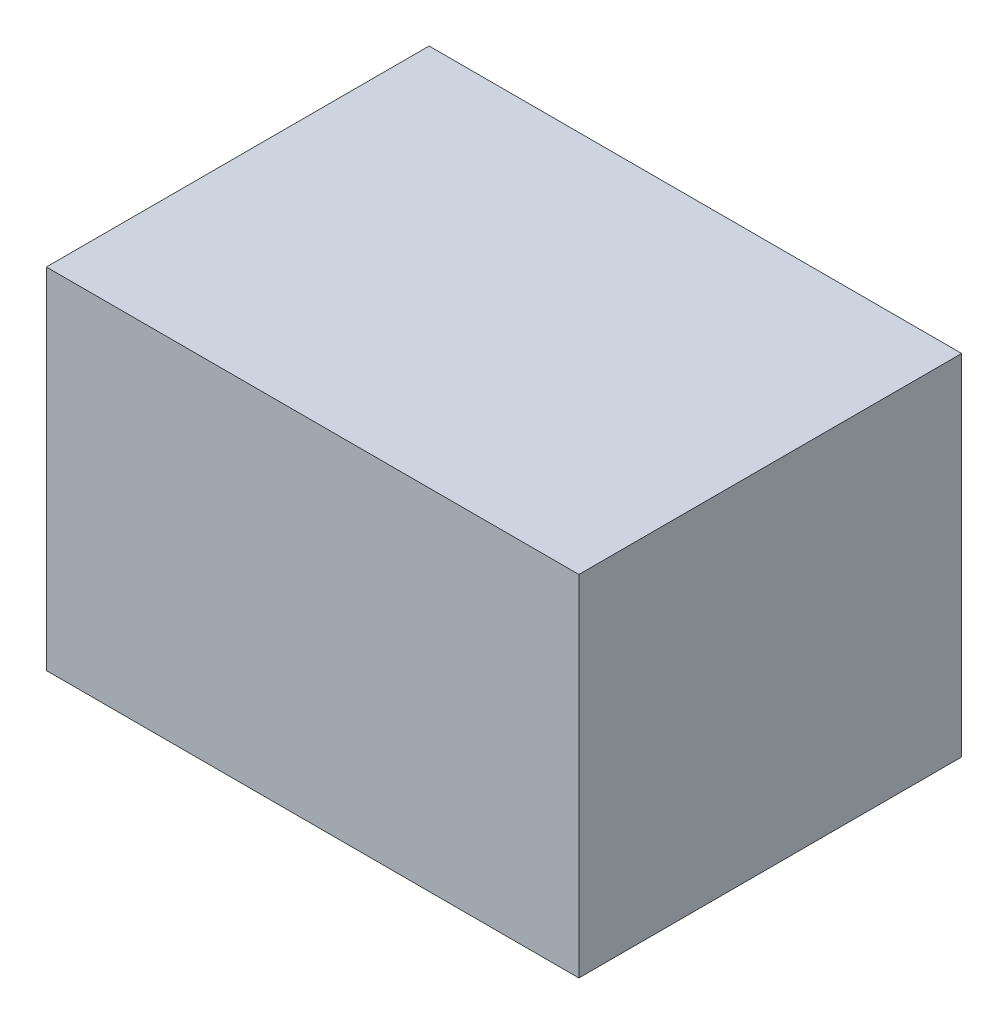
ISO-10303-21;
HEADER;
FILE_DESCRIPTION(('STEP AP214'),'2;1');
FILE_NAME('part.step','',(''),(''),'','','');
FILE_SCHEMA(('AUTOMOTIVE_DESIGN { 1 0 10303 214 1 1 1 1 }'));
ENDSEC;
DATA;
#1=APPLICATION_CONTEXT('core data for automotive mechanical design processes');
#2=APPLICATION_PROTOCOL_DEFINITION('international standard','automotive_design',2000,#1);
#3=PRODUCT_CONTEXT('',#1,'mechanical');
#4=PRODUCT('Part','Part','',(#3));
#5=PRODUCT_RELATED_PRODUCT_CATEGORY('part','',(#4));
#6=PRODUCT_DEFINITION_FORMATION('','',#4);
#7=PRODUCT_DEFINITION_CONTEXT('part definition',#1,'design');
#8=PRODUCT_DEFINITION('design','',#6,#7);
#9=PRODUCT_DEFINITION_SHAPE('','',#8);
#10=(LENGTH_UNIT() NAMED_UNIT(*) SI_UNIT(.MILLI.,.METRE.));
#11=(NAMED_UNIT(*) PLANE_ANGLE_UNIT() SI_UNIT($,.RADIAN.));
#12=(NAMED_UNIT(*) SI_UNIT($,.STERADIAN.) SOLID_ANGLE_UNIT());
#13=UNCERTAINTY_MEASURE_WITH_UNIT(LENGTH_MEASURE(1.E-05),#10,'distance_accuracy_value','');
#14=(GEOMETRIC_REPRESENTATION_CONTEXT(3) GLOBAL_UNCERTAINTY_ASSIGNED_CONTEXT((#13)) GLOBAL_UNIT_ASSIGNED_CONTEXT((#10,
#11,#12)) REPRESENTATION_CONTEXT('',''));
#15=CARTESIAN_POINT('',(0.,0.,0.));
#16=DIRECTION('',(0.,0.,1.));
#17=DIRECTION('',(1.,0.,0.));
#18=AXIS2_PLACEMENT_3D('',#15,#16,#17);
#19=CARTESIAN_POINT('',(0.,0.,0.));
#20=DIRECTION('',(0.,-1.,0.));
#21=DIRECTION('',(0.,0.,-1.));
#22=AXIS2_PLACEMENT_3D('',#19,#20,#21);
#23=PLANE('',#22);
#24=DIRECTION('',(0.,0.,-1.));
#25=VECTOR('',#24,1.);
#26=CARTESIAN_POINT('',(160.,0.,115.));
#27=LINE('',#26,#25);
#28=CARTESIAN_POINT('',(160.,0.,115.));
#29=VERTEX_POINT('',#28);
#30=CARTESIAN_POINT('',(160.,0.,-115.));
#31=VERTEX_POINT('',#30);
#32=EDGE_CURVE('E130',#29,#31,#27,.T.);
#33=ORIENTED_EDGE('',*,*,#32,.F.);
#34=DIRECTION('',(1.,0.,0.));
#35=VECTOR('',#34,1.);
#36=CARTESIAN_POINT('',(-160.,0.,115.));
#37=LINE('',#36,#35);
#38=CARTESIAN_POINT('',(-160.,0.,115.));
#39=VERTEX_POINT('',#38);
#40=EDGE_CURVE('E78',#39,#29,#37,.T.);
#41=ORIENTED_EDGE('',*,*,#40,.F.);
#42=DIRECTION('',(0.,0.,1.));
#43=VECTOR('',#42,1.);
#44=CARTESIAN_POINT('',(-160.,0.,115.));
#45=LINE('',#44,#43);
#46=CARTESIAN_POINT('',(-160.,0.,-115.));
#47=VERTEX_POINT('',#46);
#48=EDGE_CURVE('E158',#47,#39,#45,.T.);
#49=ORIENTED_EDGE('',*,*,#48,.F.);
#50=DIRECTION('',(-1.,0.,0.));
#51=VECTOR('',#50,1.);
#52=CARTESIAN_POINT('',(-160.,0.,-115.));
#53=LINE('',#52,#51);
#54=EDGE_CURVE('E134',#31,#47,#53,.T.);
#55=ORIENTED_EDGE('',*,*,#54,.F.);
#56=EDGE_LOOP('',(#33,#41,#49,#55));
#57=FACE_BOUND('',#56,.T.);
#58=DIRECTION('',(1.,0.,0.));
#59=VECTOR('',#58,1.);
#60=CARTESIAN_POINT('',(0.,0.,105.));
#61=LINE('',#60,#59);
#62=CARTESIAN_POINT('',(-150.,0.,105.));
#63=VERTEX_POINT('',#62);
#64=CARTESIAN_POINT('',(150.,0.,105.));
#65=VERTEX_POINT('',#64);
#66=EDGE_CURVE('E125',#63,#65,#61,.T.);
#67=ORIENTED_EDGE('',*,*,#66,.T.);
#68=DIRECTION('',(0.,0.,-1.));
#69=VECTOR('',#68,1.);
#70=CARTESIAN_POINT('',(150.,0.,0.));
#71=LINE('',#70,#69);
#72=CARTESIAN_POINT('',(150.,0.,-105.));
#73=VERTEX_POINT('',#72);
#74=EDGE_CURVE('E144',#65,#73,#71,.T.);
#75=ORIENTED_EDGE('',*,*,#74,.T.);
#76=DIRECTION('',(-1.,0.,0.));
#77=VECTOR('',#76,1.);
#78=CARTESIAN_POINT('',(0.,0.,-105.));
#79=LINE('',#78,#77);
#80=CARTESIAN_POINT('',(-150.,0.,-105.));
#81=VERTEX_POINT('',#80);
#82=EDGE_CURVE('E129',#73,#81,#79,.T.);
#83=ORIENTED_EDGE('',*,*,#82,.T.);
#84=DIRECTION('',(0.,0.,1.));
#85=VECTOR('',#84,1.);
#86=CARTESIAN_POINT('',(-150.,0.,0.));
#87=LINE('',#86,#85);
#88=EDGE_CURVE('E48',#81,#63,#87,.T.);
#89=ORIENTED_EDGE('',*,*,#88,.T.);
#90=EDGE_LOOP('',(#67,#75,#83,#89));
#91=FACE_BOUND('',#90,.T.);
#92=ADVANCED_FACE('F33',(#57,#91),#23,.T.);
#93=CARTESIAN_POINT('',(160.,210.,115.));
#94=DIRECTION('',(-1.,0.,0.));
#95=DIRECTION('',(0.,0.,1.));
#96=AXIS2_PLACEMENT_3D('',#93,#94,#95);
#97=PLANE('',#96);
#98=ORIENTED_EDGE('',*,*,#32,.T.);
#99=DIRECTION('',(0.,-1.,0.));
#100=VECTOR('',#99,1.);
#101=CARTESIAN_POINT('',(160.,210.,-115.));
#102=LINE('',#101,#100);
#103=CARTESIAN_POINT('',(160.,210.,-115.));
#104=VERTEX_POINT('',#103);
#105=EDGE_CURVE('E11',#104,#31,#102,.T.);
#106=ORIENTED_EDGE('',*,*,#105,.F.);
#107=DIRECTION('',(0.,0.,-1.));
#108=VECTOR('',#107,1.);
#109=CARTESIAN_POINT('',(160.,210.,115.));
#110=LINE('',#109,#108);
#111=CARTESIAN_POINT('',(160.,210.,115.));
#112=VERTEX_POINT('',#111);
#113=EDGE_CURVE('E150',#112,#104,#110,.T.);
#114=ORIENTED_EDGE('',*,*,#113,.F.);
#115=DIRECTION('',(0.,-1.,0.));
#116=VECTOR('',#115,1.);
#117=CARTESIAN_POINT('',(160.,210.,115.));
#118=LINE('',#117,#116);
#119=EDGE_CURVE('E155',#112,#29,#118,.T.);
#120=ORIENTED_EDGE('',*,*,#119,.T.);
#121=EDGE_LOOP('',(#98,#106,#114,#120));
#122=FACE_BOUND('',#121,.T.);
#123=ADVANCED_FACE('F35',(#122),#97,.F.);
#124=CARTESIAN_POINT('',(-160.,210.,-115.));
#125=DIRECTION('',(0.,0.,1.));
#126=DIRECTION('',(1.,0.,0.));
#127=AXIS2_PLACEMENT_3D('',#124,#125,#126);
#128=PLANE('',#127);
#129=ORIENTED_EDGE('',*,*,#54,.T.);
#130=DIRECTION('',(0.,-1.,0.));
#131=VECTOR('',#130,1.);
#132=CARTESIAN_POINT('',(-160.,210.,-115.));
#133=LINE('',#132,#131);
#134=CARTESIAN_POINT('',(-160.,210.,-115.));
#135=VERTEX_POINT('',#134);
#136=EDGE_CURVE('E41',#135,#47,#133,.T.);
#137=ORIENTED_EDGE('',*,*,#136,.F.);
#138=DIRECTION('',(-1.,0.,0.));
#139=VECTOR('',#138,1.);
#140=CARTESIAN_POINT('',(-160.,210.,-115.));
#141=LINE('',#140,#139);
#142=EDGE_CURVE('E85',#104,#135,#141,.T.);
#143=ORIENTED_EDGE('',*,*,#142,.F.);
#144=ORIENTED_EDGE('',*,*,#105,.T.);
#145=EDGE_LOOP('',(#129,#137,#143,#144));
#146=FACE_BOUND('',#145,.T.);
#147=ADVANCED_FACE('F184',(#146),#128,.F.);
#148=CARTESIAN_POINT('',(-160.,210.,115.));
#149=DIRECTION('',(1.,0.,0.));
#150=DIRECTION('',(0.,0.,-1.));
#151=AXIS2_PLACEMENT_3D('',#148,#149,#150);
#152=PLANE('',#151);
#153=ORIENTED_EDGE('',*,*,#48,.T.);
#154=DIRECTION('',(0.,-1.,0.));
#155=VECTOR('',#154,1.);
#156=CARTESIAN_POINT('',(-160.,210.,115.));
#157=LINE('',#156,#155);
#158=CARTESIAN_POINT('',(-160.,210.,115.));
#159=VERTEX_POINT('',#158);
#160=EDGE_CURVE('E162',#159,#39,#157,.T.);
#161=ORIENTED_EDGE('',*,*,#160,.F.);
#162=DIRECTION('',(0.,0.,1.));
#163=VECTOR('',#162,1.);
#164=CARTESIAN_POINT('',(-160.,210.,115.));
#165=LINE('',#164,#163);
#166=EDGE_CURVE('E153',#135,#159,#165,.T.);
#167=ORIENTED_EDGE('',*,*,#166,.F.);
#168=ORIENTED_EDGE('',*,*,#136,.T.);
#169=EDGE_LOOP('',(#153,#161,#167,#168));
#170=FACE_BOUND('',#169,.T.);
#171=ADVANCED_FACE('F167',(#170),#152,.F.);
#172=CARTESIAN_POINT('',(-160.,210.,115.));
#173=DIRECTION('',(0.,0.,-1.));
#174=DIRECTION('',(-1.,0.,0.));
#175=AXIS2_PLACEMENT_3D('',#172,#173,#174);
#176=PLANE('',#175);
#177=ORIENTED_EDGE('',*,*,#40,.T.);
#178=ORIENTED_EDGE('',*,*,#119,.F.);
#179=DIRECTION('',(1.,0.,0.));
#180=VECTOR('',#179,1.);
#181=CARTESIAN_POINT('',(-160.,210.,115.));
#182=LINE('',#181,#180);
#183=EDGE_CURVE('E57',#159,#112,#182,.T.);
#184=ORIENTED_EDGE('',*,*,#183,.F.);
#185=ORIENTED_EDGE('',*,*,#160,.T.);
#186=EDGE_LOOP('',(#177,#178,#184,#185));
#187=FACE_BOUND('',#186,.T.);
#188=ADVANCED_FACE('F175',(#187),#176,.F.);
#189=CARTESIAN_POINT('',(0.,210.,0.));
#190=DIRECTION('',(0.,-1.,0.));
#191=DIRECTION('',(0.,0.,-1.));
#192=AXIS2_PLACEMENT_3D('',#189,#190,#191);
#193=PLANE('',#192);
#194=ORIENTED_EDGE('',*,*,#113,.T.);
#195=ORIENTED_EDGE('',*,*,#142,.T.);
#196=ORIENTED_EDGE('',*,*,#166,.T.);
#197=ORIENTED_EDGE('',*,*,#183,.T.);
#198=EDGE_LOOP('',(#194,#195,#196,#197));
#199=FACE_BOUND('',#198,.T.);
#200=ADVANCED_FACE('F177',(#199),#193,.F.);
#201=CARTESIAN_POINT('',(150.,210.,115.));
#202=DIRECTION('',(-1.,0.,0.));
#203=DIRECTION('',(0.,0.,1.));
#204=AXIS2_PLACEMENT_3D('',#201,#202,#203);
#205=PLANE('',#204);
#206=ORIENTED_EDGE('',*,*,#74,.F.);
#207=DIRECTION('',(0.,-1.,0.));
#208=VECTOR('',#207,1.);
#209=CARTESIAN_POINT('',(150.,210.,105.));
#210=LINE('',#209,#208);
#211=CARTESIAN_POINT('',(150.,200.,105.));
#212=VERTEX_POINT('',#211);
#213=EDGE_CURVE('E124',#212,#65,#210,.T.);
#214=ORIENTED_EDGE('',*,*,#213,.F.);
#215=DIRECTION('',(0.,0.,-1.));
#216=VECTOR('',#215,1.);
#217=CARTESIAN_POINT('',(150.,200.,0.));
#218=LINE('',#217,#216);
#219=CARTESIAN_POINT('',(150.,200.,-105.));
#220=VERTEX_POINT('',#219);
#221=EDGE_CURVE('E112',#212,#220,#218,.T.);
#222=ORIENTED_EDGE('',*,*,#221,.T.);
#223=DIRECTION('',(0.,-1.,0.));
#224=VECTOR('',#223,1.);
#225=CARTESIAN_POINT('',(150.,210.,-105.));
#226=LINE('',#225,#224);
#227=EDGE_CURVE('E122',#220,#73,#226,.T.);
#228=ORIENTED_EDGE('',*,*,#227,.T.);
#229=EDGE_LOOP('',(#206,#214,#222,#228));
#230=FACE_BOUND('',#229,.T.);
#231=ADVANCED_FACE('F121',(#230),#205,.T.);
#232=CARTESIAN_POINT('',(-160.,210.,-105.));
#233=DIRECTION('',(0.,0.,1.));
#234=DIRECTION('',(1.,0.,0.));
#235=AXIS2_PLACEMENT_3D('',#232,#233,#234);
#236=PLANE('',#235);
#237=ORIENTED_EDGE('',*,*,#82,.F.);
#238=ORIENTED_EDGE('',*,*,#227,.F.);
#239=DIRECTION('',(-1.,0.,0.));
#240=VECTOR('',#239,1.);
#241=CARTESIAN_POINT('',(0.,200.,-105.));
#242=LINE('',#241,#240);
#243=CARTESIAN_POINT('',(-150.,200.,-105.));
#244=VERTEX_POINT('',#243);
#245=EDGE_CURVE('E108',#220,#244,#242,.T.);
#246=ORIENTED_EDGE('',*,*,#245,.T.);
#247=DIRECTION('',(0.,-1.,0.));
#248=VECTOR('',#247,1.);
#249=CARTESIAN_POINT('',(-150.,210.,-105.));
#250=LINE('',#249,#248);
#251=EDGE_CURVE('E131',#244,#81,#250,.T.);
#252=ORIENTED_EDGE('',*,*,#251,.T.);
#253=EDGE_LOOP('',(#237,#238,#246,#252));
#254=FACE_BOUND('',#253,.T.);
#255=ADVANCED_FACE('F127',(#254),#236,.T.);
#256=CARTESIAN_POINT('',(-150.,210.,115.));
#257=DIRECTION('',(1.,0.,0.));
#258=DIRECTION('',(0.,0.,-1.));
#259=AXIS2_PLACEMENT_3D('',#256,#257,#258);
#260=PLANE('',#259);
#261=ORIENTED_EDGE('',*,*,#88,.F.);
#262=ORIENTED_EDGE('',*,*,#251,.F.);
#263=DIRECTION('',(0.,0.,1.));
#264=VECTOR('',#263,1.);
#265=CARTESIAN_POINT('',(-150.,200.,0.));
#266=LINE('',#265,#264);
#267=CARTESIAN_POINT('',(-150.,200.,105.));
#268=VERTEX_POINT('',#267);
#269=EDGE_CURVE('E113',#244,#268,#266,.T.);
#270=ORIENTED_EDGE('',*,*,#269,.T.);
#271=DIRECTION('',(0.,-1.,0.));
#272=VECTOR('',#271,1.);
#273=CARTESIAN_POINT('',(-150.,210.,105.));
#274=LINE('',#273,#272);
#275=EDGE_CURVE('E136',#268,#63,#274,.T.);
#276=ORIENTED_EDGE('',*,*,#275,.T.);
#277=EDGE_LOOP('',(#261,#262,#270,#276));
#278=FACE_BOUND('',#277,.T.);
#279=ADVANCED_FACE('F197',(#278),#260,.T.);
#280=CARTESIAN_POINT('',(-160.,210.,105.));
#281=DIRECTION('',(0.,0.,-1.));
#282=DIRECTION('',(-1.,0.,0.));
#283=AXIS2_PLACEMENT_3D('',#280,#281,#282);
#284=PLANE('',#283);
#285=ORIENTED_EDGE('',*,*,#66,.F.);
#286=ORIENTED_EDGE('',*,*,#275,.F.);
#287=DIRECTION('',(1.,0.,0.));
#288=VECTOR('',#287,1.);
#289=CARTESIAN_POINT('',(0.,200.,105.));
#290=LINE('',#289,#288);
#291=EDGE_CURVE('E139',#268,#212,#290,.T.);
#292=ORIENTED_EDGE('',*,*,#291,.T.);
#293=ORIENTED_EDGE('',*,*,#213,.T.);
#294=EDGE_LOOP('',(#285,#286,#292,#293));
#295=FACE_BOUND('',#294,.T.);
#296=ADVANCED_FACE('F194',(#295),#284,.T.);
#297=CARTESIAN_POINT('',(0.,200.,0.));
#298=DIRECTION('',(0.,-1.,0.));
#299=DIRECTION('',(0.,0.,-1.));
#300=AXIS2_PLACEMENT_3D('',#297,#298,#299);
#301=PLANE('',#300);
#302=ORIENTED_EDGE('',*,*,#221,.F.);
#303=ORIENTED_EDGE('',*,*,#291,.F.);
#304=ORIENTED_EDGE('',*,*,#269,.F.);
#305=ORIENTED_EDGE('',*,*,#245,.F.);
#306=EDGE_LOOP('',(#302,#303,#304,#305));
#307=FACE_BOUND('',#306,.T.);
#308=ADVANCED_FACE('F110',(#307),#301,.T.);
#309=CLOSED_SHELL('',(#92,#123,#147,#171,#188,#200,#231,#255,#279,#296,#308));
#310=MANIFOLD_SOLID_BREP('B2',#309);
#311=ADVANCED_BREP_SHAPE_REPRESENTATION('',(#18,#310),#14);
#312=SHAPE_DEFINITION_REPRESENTATION(#9,#311);
ENDSEC;
END-ISO-10303-21;
